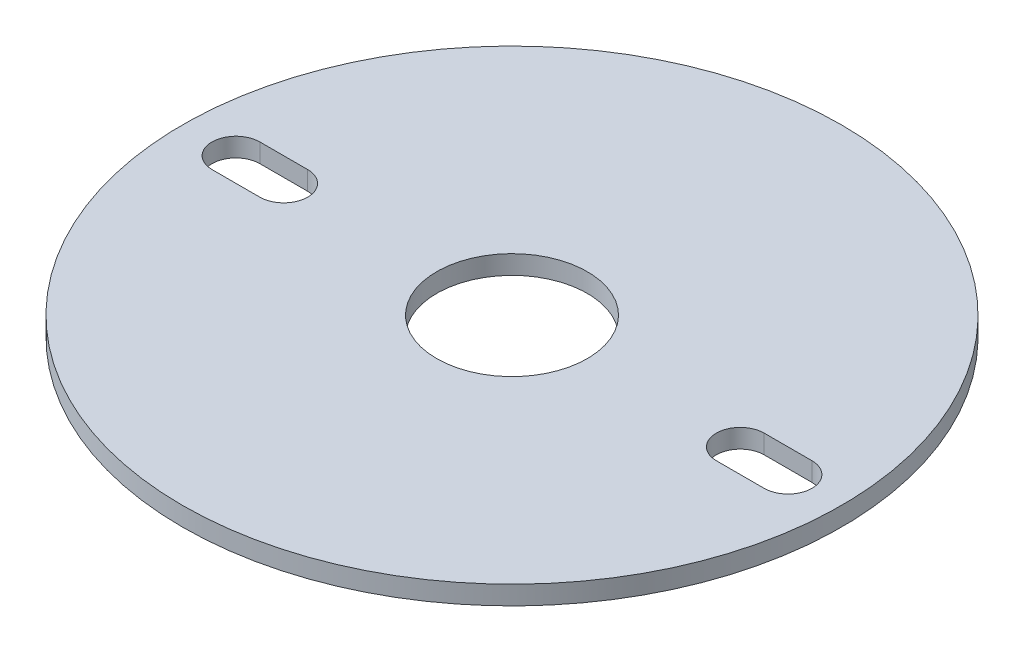
ISO-10303-21;
HEADER;
FILE_DESCRIPTION(('STEP AP214'),'2;1');
FILE_NAME('part.step','',(''),(''),'','','');
FILE_SCHEMA(('AUTOMOTIVE_DESIGN { 1 0 10303 214 1 1 1 1 }'));
ENDSEC;
DATA;
#1=APPLICATION_CONTEXT('core data for automotive mechanical design processes');
#2=APPLICATION_PROTOCOL_DEFINITION('international standard','automotive_design',2000,#1);
#3=PRODUCT_CONTEXT('',#1,'mechanical');
#4=PRODUCT('Part','Part','',(#3));
#5=PRODUCT_RELATED_PRODUCT_CATEGORY('part','',(#4));
#6=PRODUCT_DEFINITION_FORMATION('','',#4);
#7=PRODUCT_DEFINITION_CONTEXT('part definition',#1,'design');
#8=PRODUCT_DEFINITION('design','',#6,#7);
#9=PRODUCT_DEFINITION_SHAPE('','',#8);
#10=(LENGTH_UNIT() NAMED_UNIT(*) SI_UNIT(.MILLI.,.METRE.));
#11=(NAMED_UNIT(*) PLANE_ANGLE_UNIT() SI_UNIT($,.RADIAN.));
#12=(NAMED_UNIT(*) SI_UNIT($,.STERADIAN.) SOLID_ANGLE_UNIT());
#13=UNCERTAINTY_MEASURE_WITH_UNIT(LENGTH_MEASURE(1.E-05),#10,'distance_accuracy_value','');
#14=(GEOMETRIC_REPRESENTATION_CONTEXT(3) GLOBAL_UNCERTAINTY_ASSIGNED_CONTEXT((#13)) GLOBAL_UNIT_ASSIGNED_CONTEXT((#10,
#11,#12)) REPRESENTATION_CONTEXT('',''));
#15=CARTESIAN_POINT('',(0.,0.,0.));
#16=DIRECTION('',(0.,0.,1.));
#17=DIRECTION('',(1.,0.,0.));
#18=AXIS2_PLACEMENT_3D('',#15,#16,#17);
#19=CARTESIAN_POINT('',(0.,1.,0.));
#20=DIRECTION('',(0.,1.,0.));
#21=DIRECTION('',(0.,0.,1.));
#22=AXIS2_PLACEMENT_3D('',#19,#20,#21);
#23=PLANE('',#22);
#24=CARTESIAN_POINT('',(0.,1.,0.));
#25=DIRECTION('',(0.,1.,0.));
#26=DIRECTION('',(0.,0.,1.));
#27=AXIS2_PLACEMENT_3D('',#24,#25,#26);
#28=CIRCLE('',#27,4.);
#29=CARTESIAN_POINT('',(0.,1.,4.));
#30=VERTEX_POINT('',#29);
#31=EDGE_CURVE('E129',#30,#30,#28,.T.);
#32=ORIENTED_EDGE('',*,*,#31,.F.);
#33=EDGE_LOOP('',(#32));
#34=FACE_BOUND('',#33,.T.);
#35=CARTESIAN_POINT('',(0.,1.,0.));
#36=DIRECTION('',(0.,1.,0.));
#37=DIRECTION('',(0.,0.,1.));
#38=AXIS2_PLACEMENT_3D('',#35,#36,#37);
#39=CIRCLE('',#38,17.5);
#40=CARTESIAN_POINT('',(0.,1.,17.5));
#41=VERTEX_POINT('',#40);
#42=EDGE_CURVE('E11',#41,#41,#39,.T.);
#43=ORIENTED_EDGE('',*,*,#42,.T.);
#44=EDGE_LOOP('',(#43));
#45=FACE_BOUND('',#44,.T.);
#46=DIRECTION('',(-1.,0.,0.));
#47=VECTOR('',#46,1.);
#48=CARTESIAN_POINT('',(14.66,1.,-1.27));
#49=LINE('',#48,#47);
#50=CARTESIAN_POINT('',(14.66,1.,-1.27));
#51=VERTEX_POINT('',#50);
#52=CARTESIAN_POINT('',(12.12,1.,-1.27));
#53=VERTEX_POINT('',#52);
#54=EDGE_CURVE('E141',#51,#53,#49,.T.);
#55=ORIENTED_EDGE('',*,*,#54,.F.);
#56=CARTESIAN_POINT('',(14.66,1.,0.));
#57=DIRECTION('',(0.,1.,0.));
#58=DIRECTION('',(0.,0.,-1.));
#59=AXIS2_PLACEMENT_3D('',#56,#57,#58);
#60=CIRCLE('',#59,1.27);
#61=CARTESIAN_POINT('',(14.66,1.,1.27));
#62=VERTEX_POINT('',#61);
#63=EDGE_CURVE('E139',#62,#51,#60,.T.);
#64=ORIENTED_EDGE('',*,*,#63,.F.);
#65=DIRECTION('',(1.,0.,0.));
#66=VECTOR('',#65,1.);
#67=CARTESIAN_POINT('',(14.66,1.,1.27));
#68=LINE('',#67,#66);
#69=CARTESIAN_POINT('',(12.12,1.,1.27));
#70=VERTEX_POINT('',#69);
#71=EDGE_CURVE('E147',#70,#62,#68,.T.);
#72=ORIENTED_EDGE('',*,*,#71,.F.);
#73=CARTESIAN_POINT('',(12.12,1.,0.));
#74=DIRECTION('',(0.,1.,0.));
#75=DIRECTION('',(0.,0.,1.));
#76=AXIS2_PLACEMENT_3D('',#73,#74,#75);
#77=CIRCLE('',#76,1.27);
#78=EDGE_CURVE('E144',#53,#70,#77,.T.);
#79=ORIENTED_EDGE('',*,*,#78,.F.);
#80=EDGE_LOOP('',(#55,#64,#72,#79));
#81=FACE_BOUND('',#80,.T.);
#82=DIRECTION('',(1.,0.,0.));
#83=VECTOR('',#82,1.);
#84=CARTESIAN_POINT('',(-14.66,1.,1.27));
#85=LINE('',#84,#83);
#86=CARTESIAN_POINT('',(-14.66,1.,1.27));
#87=VERTEX_POINT('',#86);
#88=CARTESIAN_POINT('',(-12.12,1.,1.27));
#89=VERTEX_POINT('',#88);
#90=EDGE_CURVE('E109',#87,#89,#85,.T.);
#91=ORIENTED_EDGE('',*,*,#90,.F.);
#92=CARTESIAN_POINT('',(-14.66,1.,0.));
#93=DIRECTION('',(0.,1.,0.));
#94=DIRECTION('',(0.,0.,1.));
#95=AXIS2_PLACEMENT_3D('',#92,#93,#94);
#96=CIRCLE('',#95,1.27);
#97=CARTESIAN_POINT('',(-14.66,1.,-1.27));
#98=VERTEX_POINT('',#97);
#99=EDGE_CURVE('E101',#98,#87,#96,.T.);
#100=ORIENTED_EDGE('',*,*,#99,.F.);
#101=DIRECTION('',(-1.,0.,0.));
#102=VECTOR('',#101,1.);
#103=CARTESIAN_POINT('',(-14.66,1.,-1.27));
#104=LINE('',#103,#102);
#105=CARTESIAN_POINT('',(-12.12,1.,-1.27));
#106=VERTEX_POINT('',#105);
#107=EDGE_CURVE('E123',#106,#98,#104,.T.);
#108=ORIENTED_EDGE('',*,*,#107,.F.);
#109=CARTESIAN_POINT('',(-12.12,1.,0.));
#110=DIRECTION('',(0.,1.,0.));
#111=DIRECTION('',(0.,0.,-1.));
#112=AXIS2_PLACEMENT_3D('',#109,#110,#111);
#113=CIRCLE('',#112,1.27);
#114=EDGE_CURVE('E121',#89,#106,#113,.T.);
#115=ORIENTED_EDGE('',*,*,#114,.F.);
#116=EDGE_LOOP('',(#91,#100,#108,#115));
#117=FACE_BOUND('',#116,.T.);
#118=ADVANCED_FACE('F34',(#34,#45,#81,#117),#23,.T.);
#119=CARTESIAN_POINT('',(0.,0.,0.));
#120=DIRECTION('',(0.,1.,0.));
#121=DIRECTION('',(0.,0.,1.));
#122=AXIS2_PLACEMENT_3D('',#119,#120,#121);
#123=PLANE('',#122);
#124=CARTESIAN_POINT('',(0.,0.,0.));
#125=DIRECTION('',(0.,1.,0.));
#126=DIRECTION('',(0.,0.,1.));
#127=AXIS2_PLACEMENT_3D('',#124,#125,#126);
#128=CIRCLE('',#127,4.);
#129=CARTESIAN_POINT('',(0.,0.,4.));
#130=VERTEX_POINT('',#129);
#131=EDGE_CURVE('E38',#130,#130,#128,.T.);
#132=ORIENTED_EDGE('',*,*,#131,.T.);
#133=EDGE_LOOP('',(#132));
#134=FACE_BOUND('',#133,.T.);
#135=CARTESIAN_POINT('',(14.66,0.,0.));
#136=DIRECTION('',(0.,1.,0.));
#137=DIRECTION('',(0.,0.,-1.));
#138=AXIS2_PLACEMENT_3D('',#135,#136,#137);
#139=CIRCLE('',#138,1.27);
#140=CARTESIAN_POINT('',(14.66,0.,1.27));
#141=VERTEX_POINT('',#140);
#142=CARTESIAN_POINT('',(14.66,0.,-1.27));
#143=VERTEX_POINT('',#142);
#144=EDGE_CURVE('E117',#141,#143,#139,.T.);
#145=ORIENTED_EDGE('',*,*,#144,.T.);
#146=DIRECTION('',(-1.,0.,0.));
#147=VECTOR('',#146,1.);
#148=CARTESIAN_POINT('',(14.66,0.,-1.27));
#149=LINE('',#148,#147);
#150=CARTESIAN_POINT('',(12.12,0.,-1.27));
#151=VERTEX_POINT('',#150);
#152=EDGE_CURVE('E152',#143,#151,#149,.T.);
#153=ORIENTED_EDGE('',*,*,#152,.T.);
#154=CARTESIAN_POINT('',(12.12,0.,0.));
#155=DIRECTION('',(0.,1.,0.));
#156=DIRECTION('',(0.,0.,1.));
#157=AXIS2_PLACEMENT_3D('',#154,#155,#156);
#158=CIRCLE('',#157,1.27);
#159=CARTESIAN_POINT('',(12.12,0.,1.27));
#160=VERTEX_POINT('',#159);
#161=EDGE_CURVE('E155',#151,#160,#158,.T.);
#162=ORIENTED_EDGE('',*,*,#161,.T.);
#163=DIRECTION('',(1.,0.,0.));
#164=VECTOR('',#163,1.);
#165=CARTESIAN_POINT('',(14.66,0.,1.27));
#166=LINE('',#165,#164);
#167=EDGE_CURVE('E142',#160,#141,#166,.T.);
#168=ORIENTED_EDGE('',*,*,#167,.T.);
#169=EDGE_LOOP('',(#145,#153,#162,#168));
#170=FACE_BOUND('',#169,.T.);
#171=CARTESIAN_POINT('',(0.,0.,0.));
#172=DIRECTION('',(0.,1.,0.));
#173=DIRECTION('',(0.,0.,1.));
#174=AXIS2_PLACEMENT_3D('',#171,#172,#173);
#175=CIRCLE('',#174,17.5);
#176=CARTESIAN_POINT('',(0.,0.,17.5));
#177=VERTEX_POINT('',#176);
#178=EDGE_CURVE('E43',#177,#177,#175,.T.);
#179=ORIENTED_EDGE('',*,*,#178,.F.);
#180=EDGE_LOOP('',(#179));
#181=FACE_BOUND('',#180,.T.);
#182=CARTESIAN_POINT('',(-14.66,0.,0.));
#183=DIRECTION('',(0.,1.,0.));
#184=DIRECTION('',(0.,0.,1.));
#185=AXIS2_PLACEMENT_3D('',#182,#183,#184);
#186=CIRCLE('',#185,1.27);
#187=CARTESIAN_POINT('',(-14.66,0.,-1.27));
#188=VERTEX_POINT('',#187);
#189=CARTESIAN_POINT('',(-14.66,0.,1.27));
#190=VERTEX_POINT('',#189);
#191=EDGE_CURVE('E59',#188,#190,#186,.T.);
#192=ORIENTED_EDGE('',*,*,#191,.T.);
#193=DIRECTION('',(1.,0.,0.));
#194=VECTOR('',#193,1.);
#195=CARTESIAN_POINT('',(-14.66,0.,1.27));
#196=LINE('',#195,#194);
#197=CARTESIAN_POINT('',(-12.12,0.,1.27));
#198=VERTEX_POINT('',#197);
#199=EDGE_CURVE('E116',#190,#198,#196,.T.);
#200=ORIENTED_EDGE('',*,*,#199,.T.);
#201=CARTESIAN_POINT('',(-12.12,0.,0.));
#202=DIRECTION('',(0.,1.,0.));
#203=DIRECTION('',(0.,0.,-1.));
#204=AXIS2_PLACEMENT_3D('',#201,#202,#203);
#205=CIRCLE('',#204,1.27);
#206=CARTESIAN_POINT('',(-12.12,0.,-1.27));
#207=VERTEX_POINT('',#206);
#208=EDGE_CURVE('E131',#198,#207,#205,.T.);
#209=ORIENTED_EDGE('',*,*,#208,.T.);
#210=DIRECTION('',(-1.,0.,0.));
#211=VECTOR('',#210,1.);
#212=CARTESIAN_POINT('',(-14.66,0.,-1.27));
#213=LINE('',#212,#211);
#214=EDGE_CURVE('E110',#207,#188,#213,.T.);
#215=ORIENTED_EDGE('',*,*,#214,.T.);
#216=EDGE_LOOP('',(#192,#200,#209,#215));
#217=FACE_BOUND('',#216,.T.);
#218=ADVANCED_FACE('F172',(#134,#170,#181,#217),#123,.F.);
#219=CARTESIAN_POINT('',(0.,1.,0.));
#220=DIRECTION('',(0.,-1.,0.));
#221=DIRECTION('',(0.,0.,-1.));
#222=AXIS2_PLACEMENT_3D('',#219,#220,#221);
#223=CYLINDRICAL_SURFACE('',#222,17.5);
#224=ORIENTED_EDGE('',*,*,#42,.F.);
#225=EDGE_LOOP('',(#224));
#226=FACE_BOUND('',#225,.T.);
#227=ORIENTED_EDGE('',*,*,#178,.T.);
#228=EDGE_LOOP('',(#227));
#229=FACE_BOUND('',#228,.T.);
#230=ADVANCED_FACE('F36',(#226,#229),#223,.T.);
#231=CARTESIAN_POINT('',(14.66,1.,0.));
#232=DIRECTION('',(0.,-1.,0.));
#233=DIRECTION('',(0.,0.,-1.));
#234=AXIS2_PLACEMENT_3D('',#231,#232,#233);
#235=CYLINDRICAL_SURFACE('',#234,1.27);
#236=ORIENTED_EDGE('',*,*,#144,.F.);
#237=DIRECTION('',(0.,-1.,0.));
#238=VECTOR('',#237,1.);
#239=CARTESIAN_POINT('',(14.66,1.,1.27));
#240=LINE('',#239,#238);
#241=EDGE_CURVE('E149',#62,#141,#240,.T.);
#242=ORIENTED_EDGE('',*,*,#241,.F.);
#243=ORIENTED_EDGE('',*,*,#63,.T.);
#244=DIRECTION('',(0.,-1.,0.));
#245=VECTOR('',#244,1.);
#246=CARTESIAN_POINT('',(14.66,1.,-1.27));
#247=LINE('',#246,#245);
#248=EDGE_CURVE('E166',#51,#143,#247,.T.);
#249=ORIENTED_EDGE('',*,*,#248,.T.);
#250=EDGE_LOOP('',(#236,#242,#243,#249));
#251=FACE_BOUND('',#250,.T.);
#252=ADVANCED_FACE('F198',(#251),#235,.F.);
#253=CARTESIAN_POINT('',(14.66,1.,-1.27));
#254=DIRECTION('',(0.,0.,1.));
#255=DIRECTION('',(1.,0.,0.));
#256=AXIS2_PLACEMENT_3D('',#253,#254,#255);
#257=PLANE('',#256);
#258=ORIENTED_EDGE('',*,*,#152,.F.);
#259=ORIENTED_EDGE('',*,*,#248,.F.);
#260=ORIENTED_EDGE('',*,*,#54,.T.);
#261=DIRECTION('',(0.,-1.,0.));
#262=VECTOR('',#261,1.);
#263=CARTESIAN_POINT('',(12.12,1.,-1.27));
#264=LINE('',#263,#262);
#265=EDGE_CURVE('E164',#53,#151,#264,.T.);
#266=ORIENTED_EDGE('',*,*,#265,.T.);
#267=EDGE_LOOP('',(#258,#259,#260,#266));
#268=FACE_BOUND('',#267,.T.);
#269=ADVANCED_FACE('F201',(#268),#257,.T.);
#270=CARTESIAN_POINT('',(12.12,1.,0.));
#271=DIRECTION('',(0.,-1.,0.));
#272=DIRECTION('',(0.,0.,-1.));
#273=AXIS2_PLACEMENT_3D('',#270,#271,#272);
#274=CYLINDRICAL_SURFACE('',#273,1.27);
#275=ORIENTED_EDGE('',*,*,#161,.F.);
#276=ORIENTED_EDGE('',*,*,#265,.F.);
#277=ORIENTED_EDGE('',*,*,#78,.T.);
#278=DIRECTION('',(0.,-1.,0.));
#279=VECTOR('',#278,1.);
#280=CARTESIAN_POINT('',(12.12,1.,1.27));
#281=LINE('',#280,#279);
#282=EDGE_CURVE('E162',#70,#160,#281,.T.);
#283=ORIENTED_EDGE('',*,*,#282,.T.);
#284=EDGE_LOOP('',(#275,#276,#277,#283));
#285=FACE_BOUND('',#284,.T.);
#286=ADVANCED_FACE('F205',(#285),#274,.F.);
#287=CARTESIAN_POINT('',(14.66,1.,1.27));
#288=DIRECTION('',(0.,0.,-1.));
#289=DIRECTION('',(-1.,0.,0.));
#290=AXIS2_PLACEMENT_3D('',#287,#288,#289);
#291=PLANE('',#290);
#292=ORIENTED_EDGE('',*,*,#167,.F.);
#293=ORIENTED_EDGE('',*,*,#282,.F.);
#294=ORIENTED_EDGE('',*,*,#71,.T.);
#295=ORIENTED_EDGE('',*,*,#241,.T.);
#296=EDGE_LOOP('',(#292,#293,#294,#295));
#297=FACE_BOUND('',#296,.T.);
#298=ADVANCED_FACE('F209',(#297),#291,.T.);
#299=CARTESIAN_POINT('',(-14.66,1.,0.));
#300=DIRECTION('',(0.,-1.,0.));
#301=DIRECTION('',(0.,0.,-1.));
#302=AXIS2_PLACEMENT_3D('',#299,#300,#301);
#303=CYLINDRICAL_SURFACE('',#302,1.27);
#304=ORIENTED_EDGE('',*,*,#191,.F.);
#305=DIRECTION('',(0.,-1.,0.));
#306=VECTOR('',#305,1.);
#307=CARTESIAN_POINT('',(-14.66,1.,-1.27));
#308=LINE('',#307,#306);
#309=EDGE_CURVE('E105',#98,#188,#308,.T.);
#310=ORIENTED_EDGE('',*,*,#309,.F.);
#311=ORIENTED_EDGE('',*,*,#99,.T.);
#312=DIRECTION('',(0.,-1.,0.));
#313=VECTOR('',#312,1.);
#314=CARTESIAN_POINT('',(-14.66,1.,1.27));
#315=LINE('',#314,#313);
#316=EDGE_CURVE('E104',#87,#190,#315,.T.);
#317=ORIENTED_EDGE('',*,*,#316,.T.);
#318=EDGE_LOOP('',(#304,#310,#311,#317));
#319=FACE_BOUND('',#318,.T.);
#320=ADVANCED_FACE('F103',(#319),#303,.F.);
#321=CARTESIAN_POINT('',(-14.66,1.,1.27));
#322=DIRECTION('',(0.,0.,-1.));
#323=DIRECTION('',(-1.,0.,0.));
#324=AXIS2_PLACEMENT_3D('',#321,#322,#323);
#325=PLANE('',#324);
#326=ORIENTED_EDGE('',*,*,#199,.F.);
#327=ORIENTED_EDGE('',*,*,#316,.F.);
#328=ORIENTED_EDGE('',*,*,#90,.T.);
#329=DIRECTION('',(0.,-1.,0.));
#330=VECTOR('',#329,1.);
#331=CARTESIAN_POINT('',(-12.12,1.,1.27));
#332=LINE('',#331,#330);
#333=EDGE_CURVE('E118',#89,#198,#332,.T.);
#334=ORIENTED_EDGE('',*,*,#333,.T.);
#335=EDGE_LOOP('',(#326,#327,#328,#334));
#336=FACE_BOUND('',#335,.T.);
#337=ADVANCED_FACE('F113',(#336),#325,.T.);
#338=CARTESIAN_POINT('',(-12.12,1.,0.));
#339=DIRECTION('',(0.,-1.,0.));
#340=DIRECTION('',(0.,0.,-1.));
#341=AXIS2_PLACEMENT_3D('',#338,#339,#340);
#342=CYLINDRICAL_SURFACE('',#341,1.27);
#343=ORIENTED_EDGE('',*,*,#208,.F.);
#344=ORIENTED_EDGE('',*,*,#333,.F.);
#345=ORIENTED_EDGE('',*,*,#114,.T.);
#346=DIRECTION('',(0.,-1.,0.));
#347=VECTOR('',#346,1.);
#348=CARTESIAN_POINT('',(-12.12,1.,-1.27));
#349=LINE('',#348,#347);
#350=EDGE_CURVE('E51',#106,#207,#349,.T.);
#351=ORIENTED_EDGE('',*,*,#350,.T.);
#352=EDGE_LOOP('',(#343,#344,#345,#351));
#353=FACE_BOUND('',#352,.T.);
#354=ADVANCED_FACE('F180',(#353),#342,.F.);
#355=CARTESIAN_POINT('',(-14.66,1.,-1.27));
#356=DIRECTION('',(0.,0.,1.));
#357=DIRECTION('',(1.,0.,0.));
#358=AXIS2_PLACEMENT_3D('',#355,#356,#357);
#359=PLANE('',#358);
#360=ORIENTED_EDGE('',*,*,#214,.F.);
#361=ORIENTED_EDGE('',*,*,#350,.F.);
#362=ORIENTED_EDGE('',*,*,#107,.T.);
#363=ORIENTED_EDGE('',*,*,#309,.T.);
#364=EDGE_LOOP('',(#360,#361,#362,#363));
#365=FACE_BOUND('',#364,.T.);
#366=ADVANCED_FACE('F177',(#365),#359,.T.);
#367=CARTESIAN_POINT('',(0.,-4.,0.));
#368=DIRECTION('',(0.,1.,0.));
#369=DIRECTION('',(0.,0.,1.));
#370=AXIS2_PLACEMENT_3D('',#367,#368,#369);
#371=CYLINDRICAL_SURFACE('',#370,4.);
#372=ORIENTED_EDGE('',*,*,#31,.T.);
#373=EDGE_LOOP('',(#372));
#374=FACE_BOUND('',#373,.T.);
#375=ORIENTED_EDGE('',*,*,#131,.F.);
#376=EDGE_LOOP('',(#375));
#377=FACE_BOUND('',#376,.T.);
#378=ADVANCED_FACE('F179',(#374,#377),#371,.F.);
#379=CLOSED_SHELL('',(#118,#218,#230,#252,#269,#286,#298,#320,#337,#354,#366,#378));
#380=MANIFOLD_SOLID_BREP('B2',#379);
#381=ADVANCED_BREP_SHAPE_REPRESENTATION('',(#18,#380),#14);
#382=SHAPE_DEFINITION_REPRESENTATION(#9,#381);
ENDSEC;
END-ISO-10303-21;
